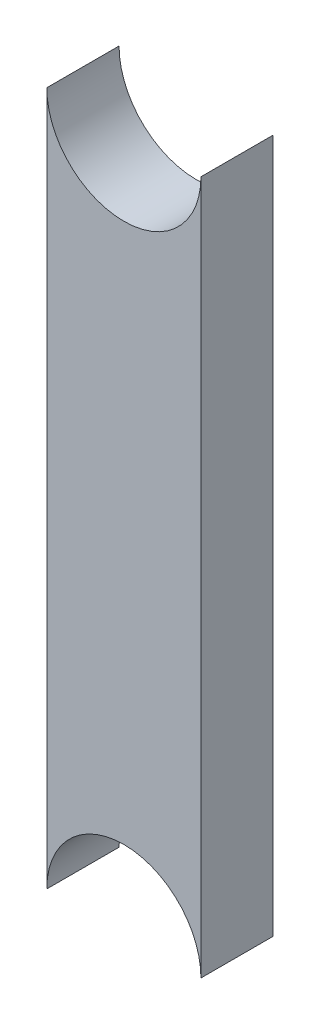
ISO-10303-21;
HEADER;
FILE_DESCRIPTION(('STEP AP214'),'2;1');
FILE_NAME('part.step','',(''),(''),'','','');
FILE_SCHEMA(('AUTOMOTIVE_DESIGN { 1 0 10303 214 1 1 1 1 }'));
ENDSEC;
DATA;
#1=APPLICATION_CONTEXT('core data for automotive mechanical design processes');
#2=APPLICATION_PROTOCOL_DEFINITION('international standard','automotive_design',2000,#1);
#3=PRODUCT_CONTEXT('',#1,'mechanical');
#4=PRODUCT('Part','Part','',(#3));
#5=PRODUCT_RELATED_PRODUCT_CATEGORY('part','',(#4));
#6=PRODUCT_DEFINITION_FORMATION('','',#4);
#7=PRODUCT_DEFINITION_CONTEXT('part definition',#1,'design');
#8=PRODUCT_DEFINITION('design','',#6,#7);
#9=PRODUCT_DEFINITION_SHAPE('','',#8);
#10=(LENGTH_UNIT() NAMED_UNIT(*) SI_UNIT(.MILLI.,.METRE.));
#11=(NAMED_UNIT(*) PLANE_ANGLE_UNIT() SI_UNIT($,.RADIAN.));
#12=(NAMED_UNIT(*) SI_UNIT($,.STERADIAN.) SOLID_ANGLE_UNIT());
#13=UNCERTAINTY_MEASURE_WITH_UNIT(LENGTH_MEASURE(1.E-05),#10,'distance_accuracy_value','');
#14=(GEOMETRIC_REPRESENTATION_CONTEXT(3) GLOBAL_UNCERTAINTY_ASSIGNED_CONTEXT((#13)) GLOBAL_UNIT_ASSIGNED_CONTEXT((#10,
#11,#12)) REPRESENTATION_CONTEXT('',''));
#15=CARTESIAN_POINT('',(0.,0.,0.));
#16=DIRECTION('',(0.,0.,1.));
#17=DIRECTION('',(1.,0.,0.));
#18=AXIS2_PLACEMENT_3D('',#15,#16,#17);
#19=CARTESIAN_POINT('',(0.,28.8,3.));
#20=DIRECTION('',(0.,0.,-1.));
#21=DIRECTION('',(-1.,0.,0.));
#22=AXIS2_PLACEMENT_3D('',#19,#20,#21);
#23=CYLINDRICAL_SURFACE('',#22,3.2);
#24=CARTESIAN_POINT('',(0.,28.8,0.));
#25=DIRECTION('',(0.,0.,-1.));
#26=DIRECTION('',(1.,0.,0.));
#27=AXIS2_PLACEMENT_3D('',#24,#25,#26);
#28=CIRCLE('',#27,3.2);
#29=CARTESIAN_POINT('',(3.2,28.8,0.));
#30=VERTEX_POINT('',#29);
#31=CARTESIAN_POINT('',(-3.2,28.8,0.));
#32=VERTEX_POINT('',#31);
#33=EDGE_CURVE('E104',#30,#32,#28,.T.);
#34=ORIENTED_EDGE('',*,*,#33,.T.);
#35=DIRECTION('',(0.,0.,-1.));
#36=VECTOR('',#35,1.);
#37=CARTESIAN_POINT('',(-3.2,28.8,3.));
#38=LINE('',#37,#36);
#39=CARTESIAN_POINT('',(-3.2,28.8,3.));
#40=VERTEX_POINT('',#39);
#41=EDGE_CURVE('E11',#40,#32,#38,.T.);
#42=ORIENTED_EDGE('',*,*,#41,.F.);
#43=CARTESIAN_POINT('',(0.,28.8,3.));
#44=DIRECTION('',(0.,0.,-1.));
#45=DIRECTION('',(1.,0.,0.));
#46=AXIS2_PLACEMENT_3D('',#43,#44,#45);
#47=CIRCLE('',#46,3.2);
#48=CARTESIAN_POINT('',(3.2,28.8,3.));
#49=VERTEX_POINT('',#48);
#50=EDGE_CURVE('E92',#49,#40,#47,.T.);
#51=ORIENTED_EDGE('',*,*,#50,.F.);
#52=DIRECTION('',(0.,0.,-1.));
#53=VECTOR('',#52,1.);
#54=CARTESIAN_POINT('',(3.2,28.8,3.));
#55=LINE('',#54,#53);
#56=EDGE_CURVE('E100',#49,#30,#55,.T.);
#57=ORIENTED_EDGE('',*,*,#56,.T.);
#58=EDGE_LOOP('',(#34,#42,#51,#57));
#59=FACE_BOUND('',#58,.T.);
#60=ADVANCED_FACE('F41',(#59),#23,.F.);
#61=CARTESIAN_POINT('',(-3.2,0.,3.));
#62=DIRECTION('',(1.,0.,0.));
#63=DIRECTION('',(0.,1.,0.));
#64=AXIS2_PLACEMENT_3D('',#61,#62,#63);
#65=PLANE('',#64);
#66=DIRECTION('',(0.,-1.,0.));
#67=VECTOR('',#66,1.);
#68=CARTESIAN_POINT('',(-3.2,0.,0.));
#69=LINE('',#68,#67);
#70=CARTESIAN_POINT('',(-3.2,0.,0.));
#71=VERTEX_POINT('',#70);
#72=EDGE_CURVE('E96',#32,#71,#69,.T.);
#73=ORIENTED_EDGE('',*,*,#72,.T.);
#74=DIRECTION('',(0.,0.,-1.));
#75=VECTOR('',#74,1.);
#76=CARTESIAN_POINT('',(-3.2,0.,3.));
#77=LINE('',#76,#75);
#78=CARTESIAN_POINT('',(-3.2,0.,3.));
#79=VERTEX_POINT('',#78);
#80=EDGE_CURVE('E49',#79,#71,#77,.T.);
#81=ORIENTED_EDGE('',*,*,#80,.F.);
#82=DIRECTION('',(0.,-1.,0.));
#83=VECTOR('',#82,1.);
#84=CARTESIAN_POINT('',(-3.2,0.,3.));
#85=LINE('',#84,#83);
#86=EDGE_CURVE('E87',#40,#79,#85,.T.);
#87=ORIENTED_EDGE('',*,*,#86,.F.);
#88=ORIENTED_EDGE('',*,*,#41,.T.);
#89=EDGE_LOOP('',(#73,#81,#87,#88));
#90=FACE_BOUND('',#89,.T.);
#91=ADVANCED_FACE('F95',(#90),#65,.F.);
#92=CARTESIAN_POINT('',(0.,0.,3.));
#93=DIRECTION('',(0.,0.,-1.));
#94=DIRECTION('',(-1.,0.,0.));
#95=AXIS2_PLACEMENT_3D('',#92,#93,#94);
#96=CYLINDRICAL_SURFACE('',#95,3.2);
#97=CARTESIAN_POINT('',(0.,0.,0.));
#98=DIRECTION('',(0.,0.,-1.));
#99=DIRECTION('',(1.,0.,0.));
#100=AXIS2_PLACEMENT_3D('',#97,#98,#99);
#101=CIRCLE('',#100,3.2);
#102=CARTESIAN_POINT('',(3.2,0.,0.));
#103=VERTEX_POINT('',#102);
#104=EDGE_CURVE('E74',#71,#103,#101,.T.);
#105=ORIENTED_EDGE('',*,*,#104,.T.);
#106=DIRECTION('',(0.,0.,-1.));
#107=VECTOR('',#106,1.);
#108=CARTESIAN_POINT('',(3.2,0.,3.));
#109=LINE('',#108,#107);
#110=CARTESIAN_POINT('',(3.2,0.,3.));
#111=VERTEX_POINT('',#110);
#112=EDGE_CURVE('E97',#111,#103,#109,.T.);
#113=ORIENTED_EDGE('',*,*,#112,.F.);
#114=CARTESIAN_POINT('',(0.,0.,3.));
#115=DIRECTION('',(0.,0.,-1.));
#116=DIRECTION('',(1.,0.,0.));
#117=AXIS2_PLACEMENT_3D('',#114,#115,#116);
#118=CIRCLE('',#117,3.2);
#119=EDGE_CURVE('E90',#79,#111,#118,.T.);
#120=ORIENTED_EDGE('',*,*,#119,.F.);
#121=ORIENTED_EDGE('',*,*,#80,.T.);
#122=EDGE_LOOP('',(#105,#113,#120,#121));
#123=FACE_BOUND('',#122,.T.);
#124=ADVANCED_FACE('F98',(#123),#96,.F.);
#125=CARTESIAN_POINT('',(3.2,28.8,3.));
#126=DIRECTION('',(-1.,0.,0.));
#127=DIRECTION('',(0.,-1.,0.));
#128=AXIS2_PLACEMENT_3D('',#125,#126,#127);
#129=PLANE('',#128);
#130=DIRECTION('',(0.,1.,0.));
#131=VECTOR('',#130,1.);
#132=CARTESIAN_POINT('',(3.2,28.8,0.));
#133=LINE('',#132,#131);
#134=EDGE_CURVE('E80',#103,#30,#133,.T.);
#135=ORIENTED_EDGE('',*,*,#134,.T.);
#136=ORIENTED_EDGE('',*,*,#56,.F.);
#137=DIRECTION('',(0.,1.,0.));
#138=VECTOR('',#137,1.);
#139=CARTESIAN_POINT('',(3.2,28.8,3.));
#140=LINE('',#139,#138);
#141=EDGE_CURVE('E57',#111,#49,#140,.T.);
#142=ORIENTED_EDGE('',*,*,#141,.F.);
#143=ORIENTED_EDGE('',*,*,#112,.T.);
#144=EDGE_LOOP('',(#135,#136,#142,#143));
#145=FACE_BOUND('',#144,.T.);
#146=ADVANCED_FACE('F111',(#145),#129,.F.);
#147=CARTESIAN_POINT('',(0.,28.8,3.));
#148=DIRECTION('',(0.,0.,1.));
#149=DIRECTION('',(1.,0.,0.));
#150=AXIS2_PLACEMENT_3D('',#147,#148,#149);
#151=PLANE('',#150);
#152=ORIENTED_EDGE('',*,*,#50,.T.);
#153=ORIENTED_EDGE('',*,*,#86,.T.);
#154=ORIENTED_EDGE('',*,*,#119,.T.);
#155=ORIENTED_EDGE('',*,*,#141,.T.);
#156=EDGE_LOOP('',(#152,#153,#154,#155));
#157=FACE_BOUND('',#156,.T.);
#158=ADVANCED_FACE('F88',(#157),#151,.T.);
#159=CARTESIAN_POINT('',(0.,28.8,0.));
#160=DIRECTION('',(0.,0.,1.));
#161=DIRECTION('',(1.,0.,0.));
#162=AXIS2_PLACEMENT_3D('',#159,#160,#161);
#163=PLANE('',#162);
#164=ORIENTED_EDGE('',*,*,#33,.F.);
#165=ORIENTED_EDGE('',*,*,#134,.F.);
#166=ORIENTED_EDGE('',*,*,#104,.F.);
#167=ORIENTED_EDGE('',*,*,#72,.F.);
#168=EDGE_LOOP('',(#164,#165,#166,#167));
#169=FACE_BOUND('',#168,.T.);
#170=ADVANCED_FACE('F114',(#169),#163,.F.);
#171=CLOSED_SHELL('',(#60,#91,#124,#146,#158,#170));
#172=MANIFOLD_SOLID_BREP('B2',#171);
#173=ADVANCED_BREP_SHAPE_REPRESENTATION('',(#18,#172),#14);
#174=SHAPE_DEFINITION_REPRESENTATION(#9,#173);
ENDSEC;
END-ISO-10303-21;
